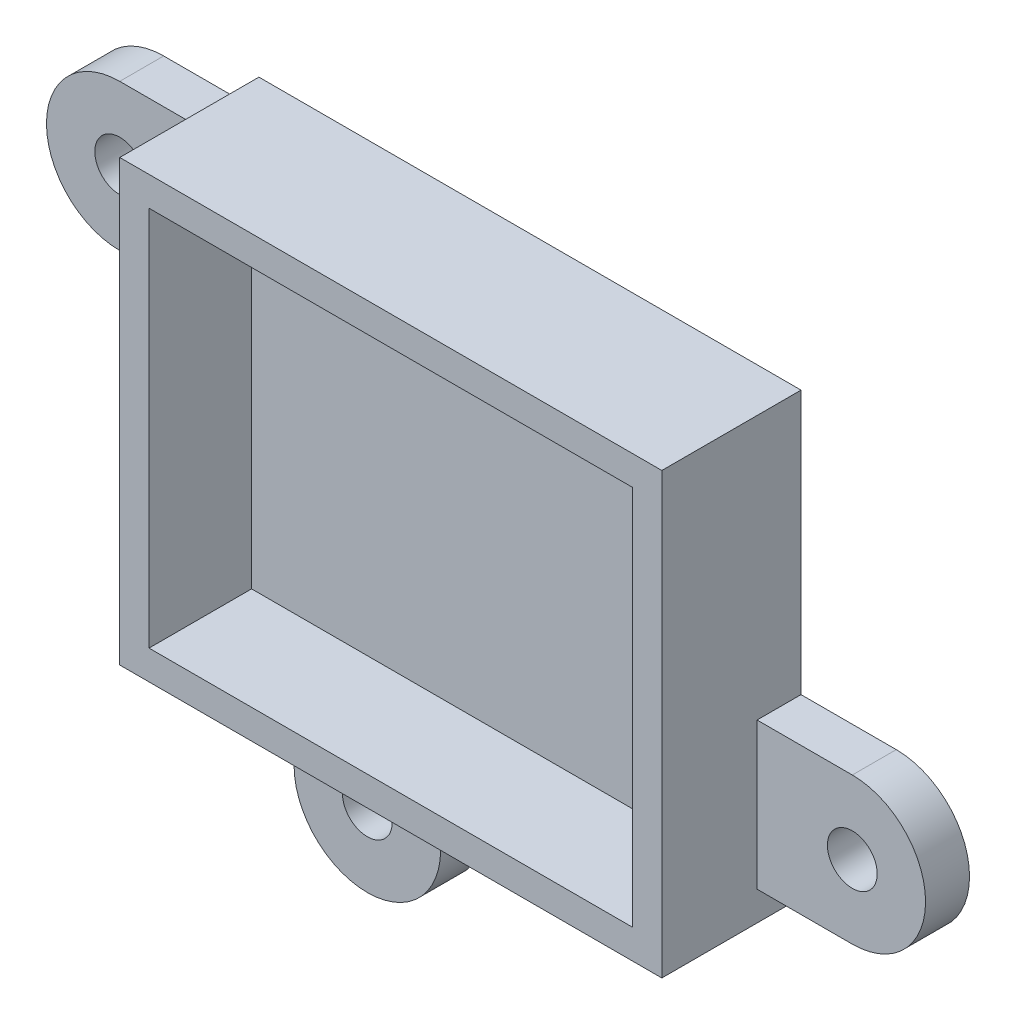
ISO-10303-21;
HEADER;
FILE_DESCRIPTION(('STEP AP214'),'2;1');
FILE_NAME('part.step','',(''),(''),'','','');
FILE_SCHEMA(('AUTOMOTIVE_DESIGN { 1 0 10303 214 1 1 1 1 }'));
ENDSEC;
DATA;
#1=APPLICATION_CONTEXT('core data for automotive mechanical design processes');
#2=APPLICATION_PROTOCOL_DEFINITION('international standard','automotive_design',2000,#1);
#3=PRODUCT_CONTEXT('',#1,'mechanical');
#4=PRODUCT('Part','Part','',(#3));
#5=PRODUCT_RELATED_PRODUCT_CATEGORY('part','',(#4));
#6=PRODUCT_DEFINITION_FORMATION('','',#4);
#7=PRODUCT_DEFINITION_CONTEXT('part definition',#1,'design');
#8=PRODUCT_DEFINITION('design','',#6,#7);
#9=PRODUCT_DEFINITION_SHAPE('','',#8);
#10=(LENGTH_UNIT() NAMED_UNIT(*) SI_UNIT(.MILLI.,.METRE.));
#11=(NAMED_UNIT(*) PLANE_ANGLE_UNIT() SI_UNIT($,.RADIAN.));
#12=(NAMED_UNIT(*) SI_UNIT($,.STERADIAN.) SOLID_ANGLE_UNIT());
#13=UNCERTAINTY_MEASURE_WITH_UNIT(LENGTH_MEASURE(1.E-05),#10,'distance_accuracy_value','');
#14=(GEOMETRIC_REPRESENTATION_CONTEXT(3) GLOBAL_UNCERTAINTY_ASSIGNED_CONTEXT((#13)) GLOBAL_UNIT_ASSIGNED_CONTEXT((#10,
#11,#12)) REPRESENTATION_CONTEXT('',''));
#15=CARTESIAN_POINT('',(0.,0.,0.));
#16=DIRECTION('',(0.,0.,1.));
#17=DIRECTION('',(1.,0.,0.));
#18=AXIS2_PLACEMENT_3D('',#15,#16,#17);
#19=CARTESIAN_POINT('',(-123.5,-115.,184.));
#20=DIRECTION('',(0.,0.,1.));
#21=DIRECTION('',(1.,0.,0.));
#22=AXIS2_PLACEMENT_3D('',#19,#20,#21);
#23=PLANE('',#22);
#24=DIRECTION('',(-1.,0.,0.));
#25=VECTOR('',#24,1.);
#26=CARTESIAN_POINT('',(-122.5,-113.,184.));
#27=LINE('',#26,#25);
#28=CARTESIAN_POINT('',(-88.5,-113.,184.));
#29=VERTEX_POINT('',#28);
#30=CARTESIAN_POINT('',(-121.5,-113.,184.));
#31=VERTEX_POINT('',#30);
#32=EDGE_CURVE('E360',#29,#31,#27,.T.);
#33=ORIENTED_EDGE('',*,*,#32,.F.);
#34=DIRECTION('',(0.,1.,0.));
#35=VECTOR('',#34,1.);
#36=CARTESIAN_POINT('',(-88.5,-114.,184.));
#37=LINE('',#36,#35);
#38=CARTESIAN_POINT('',(-88.5,-87.,184.));
#39=VERTEX_POINT('',#38);
#40=EDGE_CURVE('E236',#29,#39,#37,.T.);
#41=ORIENTED_EDGE('',*,*,#40,.T.);
#42=DIRECTION('',(-1.,0.,0.));
#43=VECTOR('',#42,1.);
#44=CARTESIAN_POINT('',(-122.5,-87.,184.));
#45=LINE('',#44,#43);
#46=CARTESIAN_POINT('',(-121.5,-87.,184.));
#47=VERTEX_POINT('',#46);
#48=EDGE_CURVE('E321',#39,#47,#45,.T.);
#49=ORIENTED_EDGE('',*,*,#48,.T.);
#50=DIRECTION('',(0.,1.,0.));
#51=VECTOR('',#50,1.);
#52=CARTESIAN_POINT('',(-121.5,-114.,184.));
#53=LINE('',#52,#51);
#54=EDGE_CURVE('E247',#31,#47,#53,.T.);
#55=ORIENTED_EDGE('',*,*,#54,.F.);
#56=EDGE_LOOP('',(#33,#41,#49,#55));
#57=FACE_BOUND('',#56,.T.);
#58=ADVANCED_FACE('F15',(#57),#23,.T.);
#59=CARTESIAN_POINT('',(-87.5,-113.,184.5));
#60=DIRECTION('',(0.,0.,1.));
#61=DIRECTION('',(1.,0.,0.));
#62=AXIS2_PLACEMENT_3D('',#59,#60,#61);
#63=PLANE('',#62);
#64=CARTESIAN_POINT('',(-80.,-108.,184.5));
#65=DIRECTION('',(0.,0.,1.));
#66=DIRECTION('',(1.,0.,0.));
#67=AXIS2_PLACEMENT_3D('',#64,#65,#66);
#68=CIRCLE('',#67,1.7);
#69=CARTESIAN_POINT('',(-78.3,-108.,184.5));
#70=VERTEX_POINT('',#69);
#71=EDGE_CURVE('E26',#70,#70,#68,.T.);
#72=ORIENTED_EDGE('',*,*,#71,.F.);
#73=EDGE_LOOP('',(#72));
#74=FACE_BOUND('',#73,.T.);
#75=DIRECTION('',(1.,0.,0.));
#76=VECTOR('',#75,1.);
#77=CARTESIAN_POINT('',(-87.5,-103.,184.5));
#78=LINE('',#77,#76);
#79=CARTESIAN_POINT('',(-86.5,-103.,184.5));
#80=VERTEX_POINT('',#79);
#81=CARTESIAN_POINT('',(-80.,-103.,184.5));
#82=VERTEX_POINT('',#81);
#83=EDGE_CURVE('E242',#80,#82,#78,.T.);
#84=ORIENTED_EDGE('',*,*,#83,.F.);
#85=DIRECTION('',(0.,-1.,0.));
#86=VECTOR('',#85,1.);
#87=CARTESIAN_POINT('',(-86.5,-114.,184.5));
#88=LINE('',#87,#86);
#89=CARTESIAN_POINT('',(-86.5,-113.,184.5));
#90=VERTEX_POINT('',#89);
#91=EDGE_CURVE('E344',#80,#90,#88,.T.);
#92=ORIENTED_EDGE('',*,*,#91,.T.);
#93=DIRECTION('',(1.,0.,0.));
#94=VECTOR('',#93,1.);
#95=CARTESIAN_POINT('',(-87.5,-113.,184.5));
#96=LINE('',#95,#94);
#97=CARTESIAN_POINT('',(-80.,-113.,184.5));
#98=VERTEX_POINT('',#97);
#99=EDGE_CURVE('E209',#90,#98,#96,.T.);
#100=ORIENTED_EDGE('',*,*,#99,.T.);
#101=CARTESIAN_POINT('',(-80.,-108.,184.5));
#102=DIRECTION('',(0.,0.,1.));
#103=DIRECTION('',(0.,-1.,0.));
#104=AXIS2_PLACEMENT_3D('',#101,#102,#103);
#105=CIRCLE('',#104,5.);
#106=EDGE_CURVE('E289',#98,#82,#105,.T.);
#107=ORIENTED_EDGE('',*,*,#106,.T.);
#108=EDGE_LOOP('',(#84,#92,#100,#107));
#109=FACE_BOUND('',#108,.T.);
#110=ADVANCED_FACE('F458',(#74,#109),#63,.T.);
#111=CARTESIAN_POINT('',(-130.,-92.,181.4));
#112=DIRECTION('',(0.,0.,1.));
#113=DIRECTION('',(1.,0.,0.));
#114=AXIS2_PLACEMENT_3D('',#111,#112,#113);
#115=CYLINDRICAL_SURFACE('',#114,1.7);
#116=DIRECTION('',(0.,0.,1.));
#117=VECTOR('',#116,1.);
#118=CARTESIAN_POINT('',(-128.3,-92.,181.4));
#119=LINE('',#118,#117);
#120=CARTESIAN_POINT('',(-128.3,-92.,181.5));
#121=VERTEX_POINT('',#120);
#122=CARTESIAN_POINT('',(-128.3,-92.,184.5));
#123=VERTEX_POINT('',#122);
#124=EDGE_CURVE('E10',#121,#123,#119,.T.);
#125=ORIENTED_EDGE('',*,*,#124,.F.);
#126=CARTESIAN_POINT('',(-130.,-92.,181.5));
#127=DIRECTION('',(0.,0.,1.));
#128=DIRECTION('',(1.,0.,0.));
#129=AXIS2_PLACEMENT_3D('',#126,#127,#128);
#130=CIRCLE('',#129,1.7);
#131=EDGE_CURVE('E223',#121,#121,#130,.T.);
#132=ORIENTED_EDGE('',*,*,#131,.F.);
#133=ORIENTED_EDGE('',*,*,#124,.T.);
#134=CARTESIAN_POINT('',(-130.,-92.,184.5));
#135=DIRECTION('',(0.,0.,1.));
#136=DIRECTION('',(1.,0.,0.));
#137=AXIS2_PLACEMENT_3D('',#134,#135,#136);
#138=CIRCLE('',#137,1.7);
#139=EDGE_CURVE('E248',#123,#123,#138,.T.);
#140=ORIENTED_EDGE('',*,*,#139,.T.);
#141=EDGE_LOOP('',(#125,#132,#133,#140));
#142=FACE_BOUND('',#141,.T.);
#143=ADVANCED_FACE('F511',(#142),#115,.F.);
#144=CARTESIAN_POINT('',(-80.,-108.,181.4));
#145=DIRECTION('',(0.,0.,1.));
#146=DIRECTION('',(1.,0.,0.));
#147=AXIS2_PLACEMENT_3D('',#144,#145,#146);
#148=CYLINDRICAL_SURFACE('',#147,1.7);
#149=DIRECTION('',(0.,0.,1.));
#150=VECTOR('',#149,1.);
#151=CARTESIAN_POINT('',(-78.3,-108.,181.4));
#152=LINE('',#151,#150);
#153=CARTESIAN_POINT('',(-78.3,-108.,181.5));
#154=VERTEX_POINT('',#153);
#155=EDGE_CURVE('E208',#154,#70,#152,.T.);
#156=ORIENTED_EDGE('',*,*,#155,.F.);
#157=CARTESIAN_POINT('',(-80.,-108.,181.5));
#158=DIRECTION('',(0.,0.,1.));
#159=DIRECTION('',(1.,0.,0.));
#160=AXIS2_PLACEMENT_3D('',#157,#158,#159);
#161=CIRCLE('',#160,1.7);
#162=EDGE_CURVE('E215',#154,#154,#161,.T.);
#163=ORIENTED_EDGE('',*,*,#162,.F.);
#164=ORIENTED_EDGE('',*,*,#155,.T.);
#165=ORIENTED_EDGE('',*,*,#71,.T.);
#166=EDGE_LOOP('',(#156,#163,#164,#165));
#167=FACE_BOUND('',#166,.T.);
#168=ADVANCED_FACE('F486',(#167),#148,.F.);
#169=CARTESIAN_POINT('',(-113.1,-121.5,181.4));
#170=DIRECTION('',(0.,0.,1.));
#171=DIRECTION('',(1.,0.,0.));
#172=AXIS2_PLACEMENT_3D('',#169,#170,#171);
#173=CYLINDRICAL_SURFACE('',#172,1.7);
#174=DIRECTION('',(0.,0.,1.));
#175=VECTOR('',#174,1.);
#176=CARTESIAN_POINT('',(-111.4,-121.5,181.4));
#177=LINE('',#176,#175);
#178=CARTESIAN_POINT('',(-111.4,-121.5,181.5));
#179=VERTEX_POINT('',#178);
#180=CARTESIAN_POINT('',(-111.4,-121.5,184.5));
#181=VERTEX_POINT('',#180);
#182=EDGE_CURVE('E201',#179,#181,#177,.T.);
#183=ORIENTED_EDGE('',*,*,#182,.F.);
#184=CARTESIAN_POINT('',(-113.1,-121.5,181.5));
#185=DIRECTION('',(0.,0.,1.));
#186=DIRECTION('',(1.,0.,0.));
#187=AXIS2_PLACEMENT_3D('',#184,#185,#186);
#188=CIRCLE('',#187,1.7);
#189=EDGE_CURVE('E204',#179,#179,#188,.T.);
#190=ORIENTED_EDGE('',*,*,#189,.F.);
#191=ORIENTED_EDGE('',*,*,#182,.T.);
#192=CARTESIAN_POINT('',(-113.1,-121.5,184.5));
#193=DIRECTION('',(0.,0.,1.));
#194=DIRECTION('',(1.,0.,0.));
#195=AXIS2_PLACEMENT_3D('',#192,#193,#194);
#196=CIRCLE('',#195,1.7);
#197=EDGE_CURVE('E206',#181,#181,#196,.T.);
#198=ORIENTED_EDGE('',*,*,#197,.T.);
#199=EDGE_LOOP('',(#183,#190,#191,#198));
#200=FACE_BOUND('',#199,.T.);
#201=ADVANCED_FACE('F203',(#200),#173,.F.);
#202=CARTESIAN_POINT('',(-113.1,-121.5,181.5));
#203=DIRECTION('',(0.,0.,1.));
#204=DIRECTION('',(1.,0.,0.));
#205=AXIS2_PLACEMENT_3D('',#202,#203,#204);
#206=CYLINDRICAL_SURFACE('',#205,5.);
#207=DIRECTION('',(0.,0.,1.));
#208=VECTOR('',#207,1.);
#209=CARTESIAN_POINT('',(-108.1,-121.5,181.5));
#210=LINE('',#209,#208);
#211=CARTESIAN_POINT('',(-108.1,-121.5,181.5));
#212=VERTEX_POINT('',#211);
#213=CARTESIAN_POINT('',(-108.1,-121.5,184.5));
#214=VERTEX_POINT('',#213);
#215=EDGE_CURVE('E317',#212,#214,#210,.T.);
#216=ORIENTED_EDGE('',*,*,#215,.T.);
#217=CARTESIAN_POINT('',(-113.1,-121.5,184.5));
#218=DIRECTION('',(0.,0.,1.));
#219=DIRECTION('',(1.,0.,0.));
#220=AXIS2_PLACEMENT_3D('',#217,#218,#219);
#221=CIRCLE('',#220,5.);
#222=CARTESIAN_POINT('',(-118.1,-121.5,184.5));
#223=VERTEX_POINT('',#222);
#224=EDGE_CURVE('E256',#223,#214,#221,.T.);
#225=ORIENTED_EDGE('',*,*,#224,.F.);
#226=DIRECTION('',(0.,0.,1.));
#227=VECTOR('',#226,1.);
#228=CARTESIAN_POINT('',(-118.1,-121.5,181.5));
#229=LINE('',#228,#227);
#230=CARTESIAN_POINT('',(-118.1,-121.5,181.5));
#231=VERTEX_POINT('',#230);
#232=EDGE_CURVE('E365',#231,#223,#229,.T.);
#233=ORIENTED_EDGE('',*,*,#232,.F.);
#234=CARTESIAN_POINT('',(-113.1,-121.5,181.5));
#235=DIRECTION('',(0.,0.,1.));
#236=DIRECTION('',(1.,0.,0.));
#237=AXIS2_PLACEMENT_3D('',#234,#235,#236);
#238=CIRCLE('',#237,5.);
#239=EDGE_CURVE('E288',#231,#212,#238,.T.);
#240=ORIENTED_EDGE('',*,*,#239,.T.);
#241=EDGE_LOOP('',(#216,#225,#233,#240));
#242=FACE_BOUND('',#241,.T.);
#243=ADVANCED_FACE('F518',(#242),#206,.T.);
#244=CARTESIAN_POINT('',(-130.,-92.,181.5));
#245=DIRECTION('',(0.,0.,1.));
#246=DIRECTION('',(1.,0.,0.));
#247=AXIS2_PLACEMENT_3D('',#244,#245,#246);
#248=CYLINDRICAL_SURFACE('',#247,5.);
#249=CARTESIAN_POINT('',(-130.,-92.,184.5));
#250=DIRECTION('',(0.,0.,1.));
#251=DIRECTION('',(1.,0.,0.));
#252=AXIS2_PLACEMENT_3D('',#249,#250,#251);
#253=CIRCLE('',#252,5.);
#254=CARTESIAN_POINT('',(-130.,-87.,184.5));
#255=VERTEX_POINT('',#254);
#256=CARTESIAN_POINT('',(-130.,-97.,184.5));
#257=VERTEX_POINT('',#256);
#258=EDGE_CURVE('E329',#255,#257,#253,.T.);
#259=ORIENTED_EDGE('',*,*,#258,.F.);
#260=DIRECTION('',(0.,0.,1.));
#261=VECTOR('',#260,1.);
#262=CARTESIAN_POINT('',(-130.,-87.,181.5));
#263=LINE('',#262,#261);
#264=CARTESIAN_POINT('',(-130.,-87.,181.5));
#265=VERTEX_POINT('',#264);
#266=EDGE_CURVE('E235',#265,#255,#263,.T.);
#267=ORIENTED_EDGE('',*,*,#266,.F.);
#268=CARTESIAN_POINT('',(-130.,-92.,181.5));
#269=DIRECTION('',(0.,0.,1.));
#270=DIRECTION('',(1.,0.,0.));
#271=AXIS2_PLACEMENT_3D('',#268,#269,#270);
#272=CIRCLE('',#271,5.);
#273=CARTESIAN_POINT('',(-130.,-97.,181.5));
#274=VERTEX_POINT('',#273);
#275=EDGE_CURVE('E295',#265,#274,#272,.T.);
#276=ORIENTED_EDGE('',*,*,#275,.T.);
#277=DIRECTION('',(0.,0.,1.));
#278=VECTOR('',#277,1.);
#279=CARTESIAN_POINT('',(-130.,-97.,181.5));
#280=LINE('',#279,#278);
#281=EDGE_CURVE('E252',#274,#257,#280,.T.);
#282=ORIENTED_EDGE('',*,*,#281,.T.);
#283=EDGE_LOOP('',(#259,#267,#276,#282));
#284=FACE_BOUND('',#283,.T.);
#285=ADVANCED_FACE('F537',(#284),#248,.T.);
#286=CARTESIAN_POINT('',(-87.5,-113.,181.5));
#287=DIRECTION('',(0.,1.,0.));
#288=DIRECTION('',(1.,0.,0.));
#289=AXIS2_PLACEMENT_3D('',#286,#287,#288);
#290=PLANE('',#289);
#291=DIRECTION('',(0.,0.,1.));
#292=VECTOR('',#291,1.);
#293=CARTESIAN_POINT('',(-80.,-113.,181.5));
#294=LINE('',#293,#292);
#295=CARTESIAN_POINT('',(-80.,-113.,181.5));
#296=VERTEX_POINT('',#295);
#297=EDGE_CURVE('E292',#296,#98,#294,.T.);
#298=ORIENTED_EDGE('',*,*,#297,.T.);
#299=ORIENTED_EDGE('',*,*,#99,.F.);
#300=DIRECTION('',(0.,0.,1.));
#301=VECTOR('',#300,1.);
#302=CARTESIAN_POINT('',(-86.5,-113.,181.5));
#303=LINE('',#302,#301);
#304=CARTESIAN_POINT('',(-86.5,-113.,181.5));
#305=VERTEX_POINT('',#304);
#306=EDGE_CURVE('E320',#305,#90,#303,.T.);
#307=ORIENTED_EDGE('',*,*,#306,.F.);
#308=DIRECTION('',(1.,0.,0.));
#309=VECTOR('',#308,1.);
#310=CARTESIAN_POINT('',(-87.5,-113.,181.5));
#311=LINE('',#310,#309);
#312=EDGE_CURVE('E414',#305,#296,#311,.T.);
#313=ORIENTED_EDGE('',*,*,#312,.T.);
#314=EDGE_LOOP('',(#298,#299,#307,#313));
#315=FACE_BOUND('',#314,.T.);
#316=ADVANCED_FACE('F462',(#315),#290,.F.);
#317=CARTESIAN_POINT('',(-80.,-108.,181.5));
#318=DIRECTION('',(0.,0.,1.));
#319=DIRECTION('',(1.,0.,0.));
#320=AXIS2_PLACEMENT_3D('',#317,#318,#319);
#321=CYLINDRICAL_SURFACE('',#320,5.);
#322=CARTESIAN_POINT('',(-80.,-108.,181.5));
#323=DIRECTION('',(0.,0.,-1.));
#324=DIRECTION('',(0.,1.,0.));
#325=AXIS2_PLACEMENT_3D('',#322,#323,#324);
#326=CIRCLE('',#325,5.);
#327=CARTESIAN_POINT('',(-80.,-103.,181.5));
#328=VERTEX_POINT('',#327);
#329=EDGE_CURVE('E439',#328,#296,#326,.T.);
#330=ORIENTED_EDGE('',*,*,#329,.F.);
#331=DIRECTION('',(0.,0.,1.));
#332=VECTOR('',#331,1.);
#333=CARTESIAN_POINT('',(-80.,-103.,181.5));
#334=LINE('',#333,#332);
#335=EDGE_CURVE('E246',#328,#82,#334,.T.);
#336=ORIENTED_EDGE('',*,*,#335,.T.);
#337=ORIENTED_EDGE('',*,*,#106,.F.);
#338=ORIENTED_EDGE('',*,*,#297,.F.);
#339=EDGE_LOOP('',(#330,#336,#337,#338));
#340=FACE_BOUND('',#339,.T.);
#341=ADVANCED_FACE('F467',(#340),#321,.T.);
#342=CARTESIAN_POINT('',(-87.5,-103.,181.5));
#343=DIRECTION('',(0.,1.,0.));
#344=DIRECTION('',(1.,0.,0.));
#345=AXIS2_PLACEMENT_3D('',#342,#343,#344);
#346=PLANE('',#345);
#347=DIRECTION('',(1.,0.,0.));
#348=VECTOR('',#347,1.);
#349=CARTESIAN_POINT('',(-87.5,-103.,181.5));
#350=LINE('',#349,#348);
#351=CARTESIAN_POINT('',(-86.5,-103.,181.5));
#352=VERTEX_POINT('',#351);
#353=EDGE_CURVE('E216',#352,#328,#350,.T.);
#354=ORIENTED_EDGE('',*,*,#353,.F.);
#355=DIRECTION('',(0.,0.,1.));
#356=VECTOR('',#355,1.);
#357=CARTESIAN_POINT('',(-86.5,-103.,181.5));
#358=LINE('',#357,#356);
#359=EDGE_CURVE('E361',#352,#80,#358,.T.);
#360=ORIENTED_EDGE('',*,*,#359,.T.);
#361=ORIENTED_EDGE('',*,*,#83,.T.);
#362=ORIENTED_EDGE('',*,*,#335,.F.);
#363=EDGE_LOOP('',(#354,#360,#361,#362));
#364=FACE_BOUND('',#363,.T.);
#365=ADVANCED_FACE('F470',(#364),#346,.T.);
#366=CARTESIAN_POINT('',(-121.5,-113.,183.9));
#367=DIRECTION('',(1.,0.,0.));
#368=DIRECTION('',(0.,1.,0.));
#369=AXIS2_PLACEMENT_3D('',#366,#367,#368);
#370=PLANE('',#369);
#371=DIRECTION('',(0.,0.,1.));
#372=VECTOR('',#371,1.);
#373=CARTESIAN_POINT('',(-121.5,-113.,183.9));
#374=LINE('',#373,#372);
#375=CARTESIAN_POINT('',(-121.5,-113.,191.));
#376=VERTEX_POINT('',#375);
#377=EDGE_CURVE('E375',#31,#376,#374,.T.);
#378=ORIENTED_EDGE('',*,*,#377,.F.);
#379=ORIENTED_EDGE('',*,*,#54,.T.);
#380=DIRECTION('',(0.,0.,1.));
#381=VECTOR('',#380,1.);
#382=CARTESIAN_POINT('',(-121.5,-87.,183.9));
#383=LINE('',#382,#381);
#384=CARTESIAN_POINT('',(-121.5,-87.,191.));
#385=VERTEX_POINT('',#384);
#386=EDGE_CURVE('E240',#47,#385,#383,.T.);
#387=ORIENTED_EDGE('',*,*,#386,.T.);
#388=DIRECTION('',(0.,1.,0.));
#389=VECTOR('',#388,1.);
#390=CARTESIAN_POINT('',(-121.5,-114.,191.));
#391=LINE('',#390,#389);
#392=EDGE_CURVE('E311',#376,#385,#391,.T.);
#393=ORIENTED_EDGE('',*,*,#392,.F.);
#394=EDGE_LOOP('',(#378,#379,#387,#393));
#395=FACE_BOUND('',#394,.T.);
#396=ADVANCED_FACE('F523',(#395),#370,.T.);
#397=CARTESIAN_POINT('',(-121.5,-87.,183.9));
#398=DIRECTION('',(0.,1.,0.));
#399=DIRECTION('',(1.,0.,0.));
#400=AXIS2_PLACEMENT_3D('',#397,#398,#399);
#401=PLANE('',#400);
#402=DIRECTION('',(-1.,0.,0.));
#403=VECTOR('',#402,1.);
#404=CARTESIAN_POINT('',(-122.5,-87.,191.));
#405=LINE('',#404,#403);
#406=CARTESIAN_POINT('',(-88.5,-87.,191.));
#407=VERTEX_POINT('',#406);
#408=EDGE_CURVE('E315',#407,#385,#405,.T.);
#409=ORIENTED_EDGE('',*,*,#408,.T.);
#410=ORIENTED_EDGE('',*,*,#386,.F.);
#411=ORIENTED_EDGE('',*,*,#48,.F.);
#412=DIRECTION('',(0.,0.,1.));
#413=VECTOR('',#412,1.);
#414=CARTESIAN_POINT('',(-88.5,-87.,183.9));
#415=LINE('',#414,#413);
#416=EDGE_CURVE('E241',#39,#407,#415,.T.);
#417=ORIENTED_EDGE('',*,*,#416,.T.);
#418=EDGE_LOOP('',(#409,#410,#411,#417));
#419=FACE_BOUND('',#418,.T.);
#420=ADVANCED_FACE('F526',(#419),#401,.F.);
#421=CARTESIAN_POINT('',(-88.5,-113.,183.9));
#422=DIRECTION('',(1.,0.,0.));
#423=DIRECTION('',(0.,1.,0.));
#424=AXIS2_PLACEMENT_3D('',#421,#422,#423);
#425=PLANE('',#424);
#426=DIRECTION('',(0.,1.,0.));
#427=VECTOR('',#426,1.);
#428=CARTESIAN_POINT('',(-88.5,-114.,191.));
#429=LINE('',#428,#427);
#430=CARTESIAN_POINT('',(-88.5,-113.,191.));
#431=VERTEX_POINT('',#430);
#432=EDGE_CURVE('E352',#431,#407,#429,.T.);
#433=ORIENTED_EDGE('',*,*,#432,.T.);
#434=ORIENTED_EDGE('',*,*,#416,.F.);
#435=ORIENTED_EDGE('',*,*,#40,.F.);
#436=DIRECTION('',(0.,0.,1.));
#437=VECTOR('',#436,1.);
#438=CARTESIAN_POINT('',(-88.5,-113.,183.9));
#439=LINE('',#438,#437);
#440=EDGE_CURVE('E357',#29,#431,#439,.T.);
#441=ORIENTED_EDGE('',*,*,#440,.T.);
#442=EDGE_LOOP('',(#433,#434,#435,#441));
#443=FACE_BOUND('',#442,.T.);
#444=ADVANCED_FACE('F551',(#443),#425,.F.);
#445=CARTESIAN_POINT('',(-121.5,-113.,183.9));
#446=DIRECTION('',(0.,1.,0.));
#447=DIRECTION('',(1.,0.,0.));
#448=AXIS2_PLACEMENT_3D('',#445,#446,#447);
#449=PLANE('',#448);
#450=ORIENTED_EDGE('',*,*,#440,.F.);
#451=ORIENTED_EDGE('',*,*,#32,.T.);
#452=ORIENTED_EDGE('',*,*,#377,.T.);
#453=DIRECTION('',(-1.,0.,0.));
#454=VECTOR('',#453,1.);
#455=CARTESIAN_POINT('',(-122.5,-113.,191.));
#456=LINE('',#455,#454);
#457=EDGE_CURVE('E316',#431,#376,#456,.T.);
#458=ORIENTED_EDGE('',*,*,#457,.F.);
#459=EDGE_LOOP('',(#450,#451,#452,#458));
#460=FACE_BOUND('',#459,.T.);
#461=ADVANCED_FACE('F522',(#460),#449,.T.);
#462=CARTESIAN_POINT('',(-86.5,-115.,181.5));
#463=DIRECTION('',(1.,0.,0.));
#464=DIRECTION('',(0.,1.,0.));
#465=AXIS2_PLACEMENT_3D('',#462,#463,#464);
#466=PLANE('',#465);
#467=DIRECTION('',(0.,0.,1.));
#468=VECTOR('',#467,1.);
#469=CARTESIAN_POINT('',(-86.5,-115.,181.5));
#470=LINE('',#469,#468);
#471=CARTESIAN_POINT('',(-86.5,-115.,181.5));
#472=VERTEX_POINT('',#471);
#473=CARTESIAN_POINT('',(-86.5,-115.,191.));
#474=VERTEX_POINT('',#473);
#475=EDGE_CURVE('E261',#472,#474,#470,.T.);
#476=ORIENTED_EDGE('',*,*,#475,.F.);
#477=DIRECTION('',(0.,1.,0.));
#478=VECTOR('',#477,1.);
#479=CARTESIAN_POINT('',(-86.5,-115.,181.5));
#480=LINE('',#479,#478);
#481=EDGE_CURVE('E410',#472,#305,#480,.T.);
#482=ORIENTED_EDGE('',*,*,#481,.T.);
#483=ORIENTED_EDGE('',*,*,#306,.T.);
#484=ORIENTED_EDGE('',*,*,#91,.F.);
#485=ORIENTED_EDGE('',*,*,#359,.F.);
#486=DIRECTION('',(0.,1.,0.));
#487=VECTOR('',#486,1.);
#488=CARTESIAN_POINT('',(-86.5,-115.,181.5));
#489=LINE('',#488,#487);
#490=CARTESIAN_POINT('',(-86.5,-85.,181.5));
#491=VERTEX_POINT('',#490);
#492=EDGE_CURVE('E227',#352,#491,#489,.T.);
#493=ORIENTED_EDGE('',*,*,#492,.T.);
#494=DIRECTION('',(0.,0.,-1.));
#495=VECTOR('',#494,1.);
#496=CARTESIAN_POINT('',(-86.5,-85.,191.));
#497=LINE('',#496,#495);
#498=CARTESIAN_POINT('',(-86.5,-85.,191.));
#499=VERTEX_POINT('',#498);
#500=EDGE_CURVE('E231',#499,#491,#497,.T.);
#501=ORIENTED_EDGE('',*,*,#500,.F.);
#502=DIRECTION('',(0.,1.,0.));
#503=VECTOR('',#502,1.);
#504=CARTESIAN_POINT('',(-86.5,-115.,191.));
#505=LINE('',#504,#503);
#506=EDGE_CURVE('E335',#474,#499,#505,.T.);
#507=ORIENTED_EDGE('',*,*,#506,.F.);
#508=EDGE_LOOP('',(#476,#482,#483,#484,#485,#493,#501,#507));
#509=FACE_BOUND('',#508,.T.);
#510=ADVANCED_FACE('F474',(#509),#466,.T.);
#511=CARTESIAN_POINT('',(-108.1,-121.5,181.5));
#512=DIRECTION('',(1.,0.,0.));
#513=DIRECTION('',(0.,1.,0.));
#514=AXIS2_PLACEMENT_3D('',#511,#512,#513);
#515=PLANE('',#514);
#516=ORIENTED_EDGE('',*,*,#215,.F.);
#517=DIRECTION('',(0.,1.,0.));
#518=VECTOR('',#517,1.);
#519=CARTESIAN_POINT('',(-108.1,-121.5,181.5));
#520=LINE('',#519,#518);
#521=CARTESIAN_POINT('',(-108.1,-115.,181.5));
#522=VERTEX_POINT('',#521);
#523=EDGE_CURVE('E348',#212,#522,#520,.T.);
#524=ORIENTED_EDGE('',*,*,#523,.T.);
#525=DIRECTION('',(0.,0.,-1.));
#526=VECTOR('',#525,1.);
#527=CARTESIAN_POINT('',(-108.1,-115.,181.5));
#528=LINE('',#527,#526);
#529=CARTESIAN_POINT('',(-108.1,-115.,184.5));
#530=VERTEX_POINT('',#529);
#531=EDGE_CURVE('E262',#530,#522,#528,.T.);
#532=ORIENTED_EDGE('',*,*,#531,.F.);
#533=DIRECTION('',(0.,1.,0.));
#534=VECTOR('',#533,1.);
#535=CARTESIAN_POINT('',(-108.1,-121.5,184.5));
#536=LINE('',#535,#534);
#537=EDGE_CURVE('E254',#214,#530,#536,.T.);
#538=ORIENTED_EDGE('',*,*,#537,.F.);
#539=EDGE_LOOP('',(#516,#524,#532,#538));
#540=FACE_BOUND('',#539,.T.);
#541=ADVANCED_FACE('F521',(#540),#515,.T.);
#542=CARTESIAN_POINT('',(-118.1,-121.5,184.5));
#543=DIRECTION('',(0.,0.,1.));
#544=DIRECTION('',(1.,0.,0.));
#545=AXIS2_PLACEMENT_3D('',#542,#543,#544);
#546=PLANE('',#545);
#547=ORIENTED_EDGE('',*,*,#197,.F.);
#548=EDGE_LOOP('',(#547));
#549=FACE_BOUND('',#548,.T.);
#550=ORIENTED_EDGE('',*,*,#537,.T.);
#551=DIRECTION('',(1.,0.,0.));
#552=VECTOR('',#551,1.);
#553=CARTESIAN_POINT('',(-120.8,-115.,184.5));
#554=LINE('',#553,#552);
#555=CARTESIAN_POINT('',(-118.1,-115.,184.5));
#556=VERTEX_POINT('',#555);
#557=EDGE_CURVE('E272',#556,#530,#554,.T.);
#558=ORIENTED_EDGE('',*,*,#557,.F.);
#559=DIRECTION('',(0.,1.,0.));
#560=VECTOR('',#559,1.);
#561=CARTESIAN_POINT('',(-118.1,-121.5,184.5));
#562=LINE('',#561,#560);
#563=EDGE_CURVE('E257',#223,#556,#562,.T.);
#564=ORIENTED_EDGE('',*,*,#563,.F.);
#565=ORIENTED_EDGE('',*,*,#224,.T.);
#566=EDGE_LOOP('',(#550,#558,#564,#565));
#567=FACE_BOUND('',#566,.T.);
#568=ADVANCED_FACE('F530',(#549,#567),#546,.T.);
#569=CARTESIAN_POINT('',(-118.1,-121.5,181.5));
#570=DIRECTION('',(1.,0.,0.));
#571=DIRECTION('',(0.,1.,0.));
#572=AXIS2_PLACEMENT_3D('',#569,#570,#571);
#573=PLANE('',#572);
#574=DIRECTION('',(0.,0.,-1.));
#575=VECTOR('',#574,1.);
#576=CARTESIAN_POINT('',(-118.1,-115.,181.5));
#577=LINE('',#576,#575);
#578=CARTESIAN_POINT('',(-118.1,-115.,181.5));
#579=VERTEX_POINT('',#578);
#580=EDGE_CURVE('E280',#556,#579,#577,.T.);
#581=ORIENTED_EDGE('',*,*,#580,.T.);
#582=DIRECTION('',(0.,1.,0.));
#583=VECTOR('',#582,1.);
#584=CARTESIAN_POINT('',(-118.1,-121.5,181.5));
#585=LINE('',#584,#583);
#586=EDGE_CURVE('E285',#231,#579,#585,.T.);
#587=ORIENTED_EDGE('',*,*,#586,.F.);
#588=ORIENTED_EDGE('',*,*,#232,.T.);
#589=ORIENTED_EDGE('',*,*,#563,.T.);
#590=EDGE_LOOP('',(#581,#587,#588,#589));
#591=FACE_BOUND('',#590,.T.);
#592=ADVANCED_FACE('F541',(#591),#573,.F.);
#593=CARTESIAN_POINT('',(-130.,-97.,181.5));
#594=DIRECTION('',(0.,1.,0.));
#595=DIRECTION('',(1.,0.,0.));
#596=AXIS2_PLACEMENT_3D('',#593,#594,#595);
#597=PLANE('',#596);
#598=DIRECTION('',(0.,0.,1.));
#599=VECTOR('',#598,1.);
#600=CARTESIAN_POINT('',(-123.5,-97.,181.5));
#601=LINE('',#600,#599);
#602=CARTESIAN_POINT('',(-123.5,-97.,181.5));
#603=VERTEX_POINT('',#602);
#604=CARTESIAN_POINT('',(-123.5,-97.,184.5));
#605=VERTEX_POINT('',#604);
#606=EDGE_CURVE('E372',#603,#605,#601,.T.);
#607=ORIENTED_EDGE('',*,*,#606,.T.);
#608=DIRECTION('',(1.,0.,0.));
#609=VECTOR('',#608,1.);
#610=CARTESIAN_POINT('',(-130.,-97.,184.5));
#611=LINE('',#610,#609);
#612=EDGE_CURVE('E253',#257,#605,#611,.T.);
#613=ORIENTED_EDGE('',*,*,#612,.F.);
#614=ORIENTED_EDGE('',*,*,#281,.F.);
#615=DIRECTION('',(1.,0.,0.));
#616=VECTOR('',#615,1.);
#617=CARTESIAN_POINT('',(-130.,-97.,181.5));
#618=LINE('',#617,#616);
#619=EDGE_CURVE('E287',#274,#603,#618,.T.);
#620=ORIENTED_EDGE('',*,*,#619,.T.);
#621=EDGE_LOOP('',(#607,#613,#614,#620));
#622=FACE_BOUND('',#621,.T.);
#623=ADVANCED_FACE('F544',(#622),#597,.F.);
#624=CARTESIAN_POINT('',(-130.,-97.,184.5));
#625=DIRECTION('',(0.,0.,1.));
#626=DIRECTION('',(1.,0.,0.));
#627=AXIS2_PLACEMENT_3D('',#624,#625,#626);
#628=PLANE('',#627);
#629=ORIENTED_EDGE('',*,*,#139,.F.);
#630=EDGE_LOOP('',(#629));
#631=FACE_BOUND('',#630,.T.);
#632=DIRECTION('',(1.,0.,0.));
#633=VECTOR('',#632,1.);
#634=CARTESIAN_POINT('',(-130.,-87.,184.5));
#635=LINE('',#634,#633);
#636=CARTESIAN_POINT('',(-123.5,-87.,184.5));
#637=VERTEX_POINT('',#636);
#638=EDGE_CURVE('E334',#255,#637,#635,.T.);
#639=ORIENTED_EDGE('',*,*,#638,.F.);
#640=ORIENTED_EDGE('',*,*,#258,.T.);
#641=ORIENTED_EDGE('',*,*,#612,.T.);
#642=DIRECTION('',(0.,-1.,0.));
#643=VECTOR('',#642,1.);
#644=CARTESIAN_POINT('',(-123.5,-106.,184.5));
#645=LINE('',#644,#643);
#646=EDGE_CURVE('E369',#637,#605,#645,.T.);
#647=ORIENTED_EDGE('',*,*,#646,.F.);
#648=EDGE_LOOP('',(#639,#640,#641,#647));
#649=FACE_BOUND('',#648,.T.);
#650=ADVANCED_FACE('F17',(#631,#649),#628,.T.);
#651=CARTESIAN_POINT('',(-130.,-87.,181.5));
#652=DIRECTION('',(0.,1.,0.));
#653=DIRECTION('',(1.,0.,0.));
#654=AXIS2_PLACEMENT_3D('',#651,#652,#653);
#655=PLANE('',#654);
#656=DIRECTION('',(1.,0.,0.));
#657=VECTOR('',#656,1.);
#658=CARTESIAN_POINT('',(-130.,-87.,181.5));
#659=LINE('',#658,#657);
#660=CARTESIAN_POINT('',(-123.5,-87.,181.5));
#661=VERTEX_POINT('',#660);
#662=EDGE_CURVE('E298',#265,#661,#659,.T.);
#663=ORIENTED_EDGE('',*,*,#662,.F.);
#664=ORIENTED_EDGE('',*,*,#266,.T.);
#665=ORIENTED_EDGE('',*,*,#638,.T.);
#666=DIRECTION('',(0.,0.,1.));
#667=VECTOR('',#666,1.);
#668=CARTESIAN_POINT('',(-123.5,-87.,181.5));
#669=LINE('',#668,#667);
#670=EDGE_CURVE('E373',#661,#637,#669,.T.);
#671=ORIENTED_EDGE('',*,*,#670,.F.);
#672=EDGE_LOOP('',(#663,#664,#665,#671));
#673=FACE_BOUND('',#672,.T.);
#674=ADVANCED_FACE('F490',(#673),#655,.T.);
#675=CARTESIAN_POINT('',(-123.5,-115.,181.5));
#676=DIRECTION('',(0.,0.,1.));
#677=DIRECTION('',(1.,0.,0.));
#678=AXIS2_PLACEMENT_3D('',#675,#676,#677);
#679=PLANE('',#678);
#680=ORIENTED_EDGE('',*,*,#131,.T.);
#681=EDGE_LOOP('',(#680));
#682=FACE_BOUND('',#681,.T.);
#683=ORIENTED_EDGE('',*,*,#162,.T.);
#684=EDGE_LOOP('',(#683));
#685=FACE_BOUND('',#684,.T.);
#686=ORIENTED_EDGE('',*,*,#189,.T.);
#687=EDGE_LOOP('',(#686));
#688=FACE_BOUND('',#687,.T.);
#689=ORIENTED_EDGE('',*,*,#329,.T.);
#690=ORIENTED_EDGE('',*,*,#312,.F.);
#691=ORIENTED_EDGE('',*,*,#481,.F.);
#692=DIRECTION('',(1.,0.,0.));
#693=VECTOR('',#692,1.);
#694=CARTESIAN_POINT('',(-123.5,-115.,181.5));
#695=LINE('',#694,#693);
#696=EDGE_CURVE('E258',#522,#472,#695,.T.);
#697=ORIENTED_EDGE('',*,*,#696,.F.);
#698=ORIENTED_EDGE('',*,*,#523,.F.);
#699=ORIENTED_EDGE('',*,*,#239,.F.);
#700=ORIENTED_EDGE('',*,*,#586,.T.);
#701=DIRECTION('',(1.,0.,0.));
#702=VECTOR('',#701,1.);
#703=CARTESIAN_POINT('',(-123.5,-115.,181.5));
#704=LINE('',#703,#702);
#705=CARTESIAN_POINT('',(-123.5,-115.,181.5));
#706=VERTEX_POINT('',#705);
#707=EDGE_CURVE('E340',#706,#579,#704,.T.);
#708=ORIENTED_EDGE('',*,*,#707,.F.);
#709=DIRECTION('',(0.,1.,0.));
#710=VECTOR('',#709,1.);
#711=CARTESIAN_POINT('',(-123.5,-115.,181.5));
#712=LINE('',#711,#710);
#713=EDGE_CURVE('E417',#706,#603,#712,.T.);
#714=ORIENTED_EDGE('',*,*,#713,.T.);
#715=ORIENTED_EDGE('',*,*,#619,.F.);
#716=ORIENTED_EDGE('',*,*,#275,.F.);
#717=ORIENTED_EDGE('',*,*,#662,.T.);
#718=DIRECTION('',(0.,1.,0.));
#719=VECTOR('',#718,1.);
#720=CARTESIAN_POINT('',(-123.5,-115.,181.5));
#721=LINE('',#720,#719);
#722=CARTESIAN_POINT('',(-123.5,-85.,181.5));
#723=VERTEX_POINT('',#722);
#724=EDGE_CURVE('E306',#661,#723,#721,.T.);
#725=ORIENTED_EDGE('',*,*,#724,.T.);
#726=DIRECTION('',(1.,0.,0.));
#727=VECTOR('',#726,1.);
#728=CARTESIAN_POINT('',(-123.5,-85.,181.5));
#729=LINE('',#728,#727);
#730=EDGE_CURVE('E356',#723,#491,#729,.T.);
#731=ORIENTED_EDGE('',*,*,#730,.T.);
#732=ORIENTED_EDGE('',*,*,#492,.F.);
#733=ORIENTED_EDGE('',*,*,#353,.T.);
#734=EDGE_LOOP('',(#689,#690,#691,#697,#698,#699,#700,#708,#714,#715,#716,#717,#725,#731,#732,#733));
#735=FACE_BOUND('',#734,.T.);
#736=ADVANCED_FACE('F212',(#682,#685,#688,#735),#679,.F.);
#737=CARTESIAN_POINT('',(-123.5,-85.,181.5));
#738=DIRECTION('',(0.,1.,0.));
#739=DIRECTION('',(1.,0.,0.));
#740=AXIS2_PLACEMENT_3D('',#737,#738,#739);
#741=PLANE('',#740);
#742=ORIENTED_EDGE('',*,*,#730,.F.);
#743=DIRECTION('',(0.,0.,-1.));
#744=VECTOR('',#743,1.);
#745=CARTESIAN_POINT('',(-123.5,-85.,191.));
#746=LINE('',#745,#744);
#747=CARTESIAN_POINT('',(-123.5,-85.,191.));
#748=VERTEX_POINT('',#747);
#749=EDGE_CURVE('E302',#748,#723,#746,.T.);
#750=ORIENTED_EDGE('',*,*,#749,.F.);
#751=DIRECTION('',(1.,0.,0.));
#752=VECTOR('',#751,1.);
#753=CARTESIAN_POINT('',(-123.5,-85.,191.));
#754=LINE('',#753,#752);
#755=EDGE_CURVE('E339',#748,#499,#754,.T.);
#756=ORIENTED_EDGE('',*,*,#755,.T.);
#757=ORIENTED_EDGE('',*,*,#500,.T.);
#758=EDGE_LOOP('',(#742,#750,#756,#757));
#759=FACE_BOUND('',#758,.T.);
#760=ADVANCED_FACE('F489',(#759),#741,.T.);
#761=CARTESIAN_POINT('',(-123.5,-115.,191.));
#762=DIRECTION('',(0.,0.,1.));
#763=DIRECTION('',(1.,0.,0.));
#764=AXIS2_PLACEMENT_3D('',#761,#762,#763);
#765=PLANE('',#764);
#766=ORIENTED_EDGE('',*,*,#457,.T.);
#767=ORIENTED_EDGE('',*,*,#392,.T.);
#768=ORIENTED_EDGE('',*,*,#408,.F.);
#769=ORIENTED_EDGE('',*,*,#432,.F.);
#770=EDGE_LOOP('',(#766,#767,#768,#769));
#771=FACE_BOUND('',#770,.T.);
#772=DIRECTION('',(0.,1.,0.));
#773=VECTOR('',#772,1.);
#774=CARTESIAN_POINT('',(-123.5,-115.,191.));
#775=LINE('',#774,#773);
#776=CARTESIAN_POINT('',(-123.5,-115.,191.));
#777=VERTEX_POINT('',#776);
#778=EDGE_CURVE('E307',#777,#748,#775,.T.);
#779=ORIENTED_EDGE('',*,*,#778,.F.);
#780=DIRECTION('',(1.,0.,0.));
#781=VECTOR('',#780,1.);
#782=CARTESIAN_POINT('',(-123.5,-115.,191.));
#783=LINE('',#782,#781);
#784=EDGE_CURVE('E19',#777,#474,#783,.T.);
#785=ORIENTED_EDGE('',*,*,#784,.T.);
#786=ORIENTED_EDGE('',*,*,#506,.T.);
#787=ORIENTED_EDGE('',*,*,#755,.F.);
#788=EDGE_LOOP('',(#779,#785,#786,#787));
#789=FACE_BOUND('',#788,.T.);
#790=ADVANCED_FACE('F498',(#771,#789),#765,.T.);
#791=CARTESIAN_POINT('',(-123.5,-115.,181.5));
#792=DIRECTION('',(0.,1.,0.));
#793=DIRECTION('',(1.,0.,0.));
#794=AXIS2_PLACEMENT_3D('',#791,#792,#793);
#795=PLANE('',#794);
#796=ORIENTED_EDGE('',*,*,#580,.F.);
#797=ORIENTED_EDGE('',*,*,#557,.T.);
#798=ORIENTED_EDGE('',*,*,#531,.T.);
#799=ORIENTED_EDGE('',*,*,#696,.T.);
#800=ORIENTED_EDGE('',*,*,#475,.T.);
#801=ORIENTED_EDGE('',*,*,#784,.F.);
#802=DIRECTION('',(0.,0.,1.));
#803=VECTOR('',#802,1.);
#804=CARTESIAN_POINT('',(-123.5,-115.,181.5));
#805=LINE('',#804,#803);
#806=EDGE_CURVE('E421',#706,#777,#805,.T.);
#807=ORIENTED_EDGE('',*,*,#806,.F.);
#808=ORIENTED_EDGE('',*,*,#707,.T.);
#809=EDGE_LOOP('',(#796,#797,#798,#799,#800,#801,#807,#808));
#810=FACE_BOUND('',#809,.T.);
#811=ADVANCED_FACE('F548',(#810),#795,.F.);
#812=CARTESIAN_POINT('',(-123.5,-115.,181.5));
#813=DIRECTION('',(1.,0.,0.));
#814=DIRECTION('',(0.,1.,0.));
#815=AXIS2_PLACEMENT_3D('',#812,#813,#814);
#816=PLANE('',#815);
#817=ORIENTED_EDGE('',*,*,#778,.T.);
#818=ORIENTED_EDGE('',*,*,#749,.T.);
#819=ORIENTED_EDGE('',*,*,#724,.F.);
#820=ORIENTED_EDGE('',*,*,#670,.T.);
#821=ORIENTED_EDGE('',*,*,#646,.T.);
#822=ORIENTED_EDGE('',*,*,#606,.F.);
#823=ORIENTED_EDGE('',*,*,#713,.F.);
#824=ORIENTED_EDGE('',*,*,#806,.T.);
#825=EDGE_LOOP('',(#817,#818,#819,#820,#821,#822,#823,#824));
#826=FACE_BOUND('',#825,.T.);
#827=ADVANCED_FACE('F555',(#826),#816,.F.);
#828=CLOSED_SHELL('',(#58,#110,#143,#168,#201,#243,#285,#316,#341,#365,#396,#420,#444,#461,#510,
#541,#568,#592,#623,#650,#674,#736,#760,#790,#811,#827));
#829=MANIFOLD_SOLID_BREP('B1',#828);
#830=ADVANCED_BREP_SHAPE_REPRESENTATION('',(#18,#829),#14);
#831=SHAPE_DEFINITION_REPRESENTATION(#9,#830);
ENDSEC;
END-ISO-10303-21;
